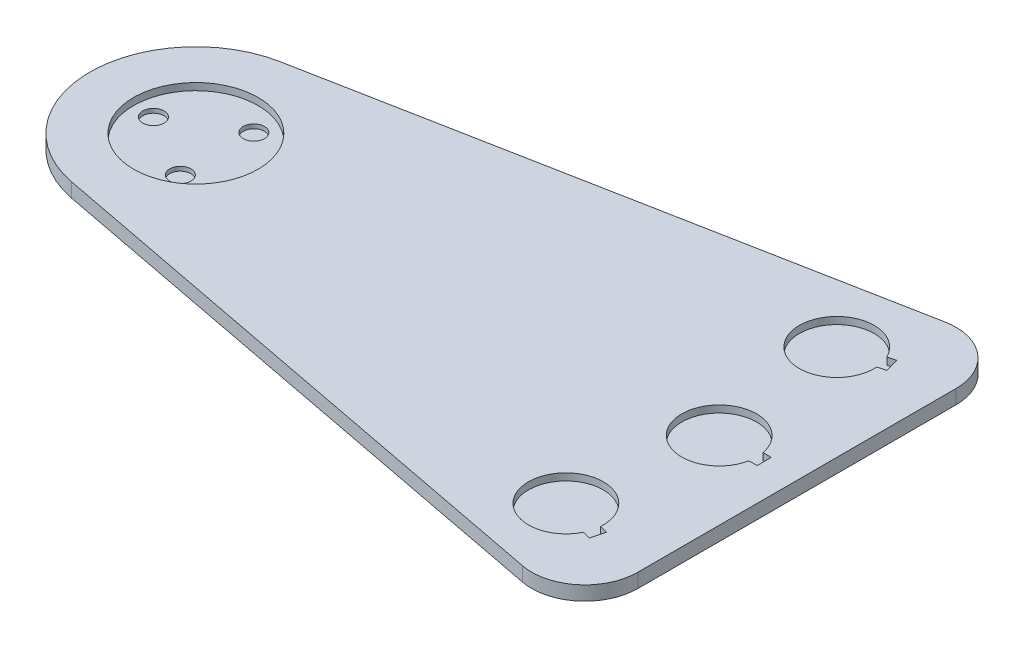
ISO-10303-21;
HEADER;
FILE_DESCRIPTION(('STEP AP214'),'2;1');
FILE_NAME('part.step','',(''),(''),'','','');
FILE_SCHEMA(('AUTOMOTIVE_DESIGN { 1 0 10303 214 1 1 1 1 }'));
ENDSEC;
DATA;
#1=APPLICATION_CONTEXT('core data for automotive mechanical design processes');
#2=APPLICATION_PROTOCOL_DEFINITION('international standard','automotive_design',2000,#1);
#3=PRODUCT_CONTEXT('',#1,'mechanical');
#4=PRODUCT('Part','Part','',(#3));
#5=PRODUCT_RELATED_PRODUCT_CATEGORY('part','',(#4));
#6=PRODUCT_DEFINITION_FORMATION('','',#4);
#7=PRODUCT_DEFINITION_CONTEXT('part definition',#1,'design');
#8=PRODUCT_DEFINITION('design','',#6,#7);
#9=PRODUCT_DEFINITION_SHAPE('','',#8);
#10=(LENGTH_UNIT() NAMED_UNIT(*) SI_UNIT(.MILLI.,.METRE.));
#11=(NAMED_UNIT(*) PLANE_ANGLE_UNIT() SI_UNIT($,.RADIAN.));
#12=(NAMED_UNIT(*) SI_UNIT($,.STERADIAN.) SOLID_ANGLE_UNIT());
#13=UNCERTAINTY_MEASURE_WITH_UNIT(LENGTH_MEASURE(1.E-05),#10,'distance_accuracy_value','');
#14=(GEOMETRIC_REPRESENTATION_CONTEXT(3) GLOBAL_UNCERTAINTY_ASSIGNED_CONTEXT((#13)) GLOBAL_UNIT_ASSIGNED_CONTEXT((#10,
#11,#12)) REPRESENTATION_CONTEXT('',''));
#15=CARTESIAN_POINT('',(0.,0.,0.));
#16=DIRECTION('',(0.,0.,1.));
#17=DIRECTION('',(1.,0.,0.));
#18=AXIS2_PLACEMENT_3D('',#15,#16,#17);
#19=CARTESIAN_POINT('',(0.,10.,0.));
#20=DIRECTION('',(0.,1.,0.));
#21=DIRECTION('',(0.,0.,1.));
#22=AXIS2_PLACEMENT_3D('',#19,#20,#21);
#23=PLANE('',#22);
#24=CARTESIAN_POINT('',(-175.,10.,0.));
#25=DIRECTION('',(0.,1.,0.));
#26=DIRECTION('',(0.,0.,1.));
#27=AXIS2_PLACEMENT_3D('',#24,#25,#26);
#28=CIRCLE('',#27,44.);
#29=CARTESIAN_POINT('',(-175.,10.,43.9999999999999));
#30=VERTEX_POINT('',#29);
#31=EDGE_CURVE('E619',#30,#30,#28,.T.);
#32=ORIENTED_EDGE('',*,*,#31,.F.);
#33=EDGE_LOOP('',(#32));
#34=FACE_BOUND('',#33,.T.);
#35=CARTESIAN_POINT('',(182.392555726955,10.,-95.7630466879329));
#36=DIRECTION('',(0.,1.,0.));
#37=DIRECTION('',(0.258819045102521,0.,0.965925826289068));
#38=AXIS2_PLACEMENT_3D('',#35,#36,#37);
#39=CIRCLE('',#38,26.46);
#40=CARTESIAN_POINT('',(206.196395839809,10.,-107.317647324982));
#41=VERTEX_POINT('',#40);
#42=CARTESIAN_POINT('',(208.784586290834,10.,-97.6583890620914));
#43=VERTEX_POINT('',#42);
#44=EDGE_CURVE('E57',#41,#43,#39,.T.);
#45=ORIENTED_EDGE('',*,*,#44,.F.);
#46=DIRECTION('',(0.965925826289068,0.,-0.258819045102521));
#47=VECTOR('',#46,1.);
#48=CARTESIAN_POINT('',(-7.2570756249257,10.,-50.1229620243866));
#49=LINE('',#48,#47);
#50=CARTESIAN_POINT('',(211.863198068749,10.,-108.836062405894));
#51=VERTEX_POINT('',#50);
#52=EDGE_CURVE('E202',#41,#51,#49,.T.);
#53=ORIENTED_EDGE('',*,*,#52,.T.);
#54=DIRECTION('',(0.258819045102521,0.,0.965925826289068));
#55=VECTOR('',#54,1.);
#56=CARTESIAN_POINT('',(213.157293294262,10.,-104.006433274448));
#57=LINE('',#56,#55);
#58=CARTESIAN_POINT('',(214.451388519775,10.,-99.1768041430029));
#59=VERTEX_POINT('',#58);
#60=EDGE_CURVE('E214',#51,#59,#57,.T.);
#61=ORIENTED_EDGE('',*,*,#60,.T.);
#62=DIRECTION('',(0.965925826289068,0.,-0.258819045102521));
#63=VECTOR('',#62,1.);
#64=CARTESIAN_POINT('',(-4.66888517390049,10.,-40.4637037614959));
#65=LINE('',#64,#63);
#66=EDGE_CURVE('E211',#43,#59,#65,.T.);
#67=ORIENTED_EDGE('',*,*,#66,.F.);
#68=EDGE_LOOP('',(#45,#53,#61,#67));
#69=FACE_BOUND('',#68,.T.);
#70=CARTESIAN_POINT('',(195.,10.,0.));
#71=DIRECTION('',(0.,1.,0.));
#72=DIRECTION('',(0.,0.,1.));
#73=AXIS2_PLACEMENT_3D('',#70,#71,#72);
#74=CIRCLE('',#73,26.46);
#75=CARTESIAN_POINT('',(220.983294633283,10.,-5.));
#76=VERTEX_POINT('',#75);
#77=CARTESIAN_POINT('',(220.983294633283,10.,5.));
#78=VERTEX_POINT('',#77);
#79=EDGE_CURVE('E221',#76,#78,#74,.T.);
#80=ORIENTED_EDGE('',*,*,#79,.F.);
#81=DIRECTION('',(1.,0.,0.));
#82=VECTOR('',#81,1.);
#83=CARTESIAN_POINT('',(0.,10.,-5.));
#84=LINE('',#83,#82);
#85=CARTESIAN_POINT('',(226.85,10.,-5.));
#86=VERTEX_POINT('',#85);
#87=EDGE_CURVE('E231',#76,#86,#84,.T.);
#88=ORIENTED_EDGE('',*,*,#87,.T.);
#89=DIRECTION('',(0.,0.,1.));
#90=VECTOR('',#89,1.);
#91=CARTESIAN_POINT('',(226.85,10.,0.));
#92=LINE('',#91,#90);
#93=CARTESIAN_POINT('',(226.85,10.,5.));
#94=VERTEX_POINT('',#93);
#95=EDGE_CURVE('E243',#86,#94,#92,.T.);
#96=ORIENTED_EDGE('',*,*,#95,.T.);
#97=DIRECTION('',(1.,0.,0.));
#98=VECTOR('',#97,1.);
#99=CARTESIAN_POINT('',(0.,10.,5.));
#100=LINE('',#99,#98);
#101=EDGE_CURVE('E240',#78,#94,#100,.T.);
#102=ORIENTED_EDGE('',*,*,#101,.F.);
#103=EDGE_LOOP('',(#80,#88,#96,#102));
#104=FACE_BOUND('',#103,.T.);
#105=DIRECTION('',(0.,0.,-1.));
#106=VECTOR('',#105,1.);
#107=CARTESIAN_POINT('',(250.,10.,-150.));
#108=LINE('',#107,#106);
#109=CARTESIAN_POINT('',(250.,10.,112.5));
#110=VERTEX_POINT('',#109);
#111=CARTESIAN_POINT('',(250.,10.,-112.5));
#112=VERTEX_POINT('',#111);
#113=EDGE_CURVE('E291',#110,#112,#108,.T.);
#114=ORIENTED_EDGE('',*,*,#113,.T.);
#115=CARTESIAN_POINT('',(212.5,10.,-112.5));
#116=DIRECTION('',(0.,1.,0.));
#117=DIRECTION('',(0.,0.,1.));
#118=AXIS2_PLACEMENT_3D('',#115,#116,#117);
#119=CIRCLE('',#118,37.5);
#120=CARTESIAN_POINT('',(205.4367974002,10.,-149.328808954868));
#121=VERTEX_POINT('',#120);
#122=EDGE_CURVE('E271',#112,#121,#119,.T.);
#123=ORIENTED_EDGE('',*,*,#122,.T.);
#124=DIRECTION('',(-0.982101572129816,0.,0.188352069328011));
#125=VECTOR('',#124,1.);
#126=CARTESIAN_POINT('',(-189.126405199601,10.,-73.6576179097362));
#127=LINE('',#126,#125);
#128=CARTESIAN_POINT('',(-189.126405199601,10.,-73.6576179097362));
#129=VERTEX_POINT('',#128);
#130=EDGE_CURVE('E261',#121,#129,#127,.T.);
#131=ORIENTED_EDGE('',*,*,#130,.T.);
#132=CARTESIAN_POINT('',(-175.,10.,0.));
#133=DIRECTION('',(0.,1.,0.));
#134=DIRECTION('',(0.,0.,1.));
#135=AXIS2_PLACEMENT_3D('',#132,#133,#134);
#136=CIRCLE('',#135,75.);
#137=CARTESIAN_POINT('',(-189.126405199601,10.,73.6576179097362));
#138=VERTEX_POINT('',#137);
#139=EDGE_CURVE('E250',#129,#138,#136,.T.);
#140=ORIENTED_EDGE('',*,*,#139,.T.);
#141=DIRECTION('',(0.982101572129816,0.,0.188352069328011));
#142=VECTOR('',#141,1.);
#143=CARTESIAN_POINT('',(-189.126405199601,10.,73.6576179097362));
#144=LINE('',#143,#142);
#145=CARTESIAN_POINT('',(205.4367974002,10.,149.328808954868));
#146=VERTEX_POINT('',#145);
#147=EDGE_CURVE('E266',#138,#146,#144,.T.);
#148=ORIENTED_EDGE('',*,*,#147,.T.);
#149=CARTESIAN_POINT('',(212.5,10.,112.5));
#150=DIRECTION('',(0.,1.,0.));
#151=DIRECTION('',(0.,0.,1.));
#152=AXIS2_PLACEMENT_3D('',#149,#150,#151);
#153=CIRCLE('',#152,37.5);
#154=EDGE_CURVE('E269',#146,#110,#153,.T.);
#155=ORIENTED_EDGE('',*,*,#154,.T.);
#156=EDGE_LOOP('',(#114,#123,#131,#140,#148,#155));
#157=FACE_BOUND('',#156,.T.);
#158=DIRECTION('',(0.965925826289068,0.,0.258819045102521));
#159=VECTOR('',#158,1.);
#160=CARTESIAN_POINT('',(-7.2570756249257,10.,50.1229620243866));
#161=LINE('',#160,#159);
#162=CARTESIAN_POINT('',(206.196395839809,10.,107.317647324982));
#163=VERTEX_POINT('',#162);
#164=CARTESIAN_POINT('',(211.863198068749,10.,108.836062405894));
#165=VERTEX_POINT('',#164);
#166=EDGE_CURVE('E185',#163,#165,#161,.T.);
#167=ORIENTED_EDGE('',*,*,#166,.F.);
#168=CARTESIAN_POINT('',(182.392555726955,10.,95.7630466879329));
#169=DIRECTION('',(0.,-1.,0.));
#170=DIRECTION('',(0.258819045102521,0.,-0.965925826289068));
#171=AXIS2_PLACEMENT_3D('',#168,#169,#170);
#172=CIRCLE('',#171,26.46);
#173=CARTESIAN_POINT('',(208.784586290834,10.,97.6583890620914));
#174=VERTEX_POINT('',#173);
#175=EDGE_CURVE('E49',#163,#174,#172,.T.);
#176=ORIENTED_EDGE('',*,*,#175,.T.);
#177=DIRECTION('',(0.965925826289068,0.,0.258819045102521));
#178=VECTOR('',#177,1.);
#179=CARTESIAN_POINT('',(-4.66888517390049,10.,40.4637037614959));
#180=LINE('',#179,#178);
#181=CARTESIAN_POINT('',(214.451388519775,10.,99.1768041430029));
#182=VERTEX_POINT('',#181);
#183=EDGE_CURVE('E174',#174,#182,#180,.T.);
#184=ORIENTED_EDGE('',*,*,#183,.T.);
#185=DIRECTION('',(0.258819045102521,0.,-0.965925826289068));
#186=VECTOR('',#185,1.);
#187=CARTESIAN_POINT('',(213.157293294262,10.,104.006433274448));
#188=LINE('',#187,#186);
#189=EDGE_CURVE('E188',#165,#182,#188,.T.);
#190=ORIENTED_EDGE('',*,*,#189,.F.);
#191=EDGE_LOOP('',(#167,#176,#184,#190));
#192=FACE_BOUND('',#191,.T.);
#193=ADVANCED_FACE('F33',(#34,#69,#104,#157,#192),#23,.T.);
#194=CARTESIAN_POINT('',(250.,10.,-150.));
#195=DIRECTION('',(-1.,0.,0.));
#196=DIRECTION('',(0.,0.,1.));
#197=AXIS2_PLACEMENT_3D('',#194,#195,#196);
#198=PLANE('',#197);
#199=DIRECTION('',(0.,0.,-1.));
#200=VECTOR('',#199,1.);
#201=CARTESIAN_POINT('',(250.,0.,-150.));
#202=LINE('',#201,#200);
#203=CARTESIAN_POINT('',(250.,0.,112.5));
#204=VERTEX_POINT('',#203);
#205=CARTESIAN_POINT('',(250.,0.,-112.5));
#206=VERTEX_POINT('',#205);
#207=EDGE_CURVE('E277',#204,#206,#202,.T.);
#208=ORIENTED_EDGE('',*,*,#207,.T.);
#209=DIRECTION('',(0.,1.,0.));
#210=VECTOR('',#209,1.);
#211=CARTESIAN_POINT('',(250.,0.,-112.5));
#212=LINE('',#211,#210);
#213=EDGE_CURVE('E281',#206,#112,#212,.T.);
#214=ORIENTED_EDGE('',*,*,#213,.T.);
#215=ORIENTED_EDGE('',*,*,#113,.F.);
#216=DIRECTION('',(0.,1.,0.));
#217=VECTOR('',#216,1.);
#218=CARTESIAN_POINT('',(250.,0.,112.5));
#219=LINE('',#218,#217);
#220=EDGE_CURVE('E284',#204,#110,#219,.T.);
#221=ORIENTED_EDGE('',*,*,#220,.F.);
#222=EDGE_LOOP('',(#208,#214,#215,#221));
#223=FACE_BOUND('',#222,.T.);
#224=ADVANCED_FACE('F35',(#223),#198,.F.);
#225=CARTESIAN_POINT('',(0.,0.,0.));
#226=DIRECTION('',(0.,1.,0.));
#227=DIRECTION('',(0.,0.,1.));
#228=AXIS2_PLACEMENT_3D('',#225,#226,#227);
#229=PLANE('',#228);
#230=CARTESIAN_POINT('',(212.5,0.,-112.5));
#231=DIRECTION('',(0.,1.,0.));
#232=DIRECTION('',(0.,0.,1.));
#233=AXIS2_PLACEMENT_3D('',#230,#231,#232);
#234=CIRCLE('',#233,37.5);
#235=CARTESIAN_POINT('',(205.4367974002,0.,-149.328808954868));
#236=VERTEX_POINT('',#235);
#237=EDGE_CURVE('E12',#206,#236,#234,.T.);
#238=ORIENTED_EDGE('',*,*,#237,.F.);
#239=ORIENTED_EDGE('',*,*,#207,.F.);
#240=CARTESIAN_POINT('',(212.5,0.,112.5));
#241=DIRECTION('',(0.,1.,0.));
#242=DIRECTION('',(0.,0.,1.));
#243=AXIS2_PLACEMENT_3D('',#240,#241,#242);
#244=CIRCLE('',#243,37.5);
#245=CARTESIAN_POINT('',(205.4367974002,0.,149.328808954868));
#246=VERTEX_POINT('',#245);
#247=EDGE_CURVE('E294',#246,#204,#244,.T.);
#248=ORIENTED_EDGE('',*,*,#247,.F.);
#249=DIRECTION('',(0.982101572129816,0.,0.188352069328011));
#250=VECTOR('',#249,1.);
#251=CARTESIAN_POINT('',(-189.126405199601,0.,73.6576179097362));
#252=LINE('',#251,#250);
#253=CARTESIAN_POINT('',(-189.126405199601,0.,73.6576179097362));
#254=VERTEX_POINT('',#253);
#255=EDGE_CURVE('E257',#254,#246,#252,.T.);
#256=ORIENTED_EDGE('',*,*,#255,.F.);
#257=CARTESIAN_POINT('',(-175.,0.,0.));
#258=DIRECTION('',(0.,1.,0.));
#259=DIRECTION('',(0.,0.,1.));
#260=AXIS2_PLACEMENT_3D('',#257,#258,#259);
#261=CIRCLE('',#260,75.);
#262=CARTESIAN_POINT('',(-189.126405199601,0.,-73.6576179097362));
#263=VERTEX_POINT('',#262);
#264=EDGE_CURVE('E42',#263,#254,#261,.T.);
#265=ORIENTED_EDGE('',*,*,#264,.F.);
#266=DIRECTION('',(-0.982101572129816,0.,0.188352069328011));
#267=VECTOR('',#266,1.);
#268=CARTESIAN_POINT('',(-189.126405199601,0.,-73.6576179097362));
#269=LINE('',#268,#267);
#270=EDGE_CURVE('E260',#236,#263,#269,.T.);
#271=ORIENTED_EDGE('',*,*,#270,.F.);
#272=EDGE_LOOP('',(#238,#239,#248,#256,#265,#271));
#273=FACE_BOUND('',#272,.T.);
#274=ADVANCED_FACE('F307',(#273),#229,.F.);
#275=CARTESIAN_POINT('',(-175.,0.,0.));
#276=DIRECTION('',(0.,1.,0.));
#277=DIRECTION('',(0.,0.,1.));
#278=AXIS2_PLACEMENT_3D('',#275,#276,#277);
#279=CYLINDRICAL_SURFACE('',#278,75.);
#280=DIRECTION('',(0.,1.,0.));
#281=VECTOR('',#280,1.);
#282=CARTESIAN_POINT('',(-189.126405199601,0.,-73.6576179097362));
#283=LINE('',#282,#281);
#284=EDGE_CURVE('E275',#263,#129,#283,.T.);
#285=ORIENTED_EDGE('',*,*,#284,.F.);
#286=ORIENTED_EDGE('',*,*,#264,.T.);
#287=DIRECTION('',(0.,1.,0.));
#288=VECTOR('',#287,1.);
#289=CARTESIAN_POINT('',(-189.126405199601,0.,73.6576179097362));
#290=LINE('',#289,#288);
#291=EDGE_CURVE('E264',#254,#138,#290,.T.);
#292=ORIENTED_EDGE('',*,*,#291,.T.);
#293=ORIENTED_EDGE('',*,*,#139,.F.);
#294=EDGE_LOOP('',(#285,#286,#292,#293));
#295=FACE_BOUND('',#294,.T.);
#296=ADVANCED_FACE('F302',(#295),#279,.T.);
#297=CARTESIAN_POINT('',(212.5,0.,-112.5));
#298=DIRECTION('',(0.,1.,0.));
#299=DIRECTION('',(0.,0.,1.));
#300=AXIS2_PLACEMENT_3D('',#297,#298,#299);
#301=CYLINDRICAL_SURFACE('',#300,37.5);
#302=ORIENTED_EDGE('',*,*,#213,.F.);
#303=ORIENTED_EDGE('',*,*,#237,.T.);
#304=DIRECTION('',(0.,1.,0.));
#305=VECTOR('',#304,1.);
#306=CARTESIAN_POINT('',(205.4367974002,0.,-149.328808954868));
#307=LINE('',#306,#305);
#308=EDGE_CURVE('E278',#236,#121,#307,.T.);
#309=ORIENTED_EDGE('',*,*,#308,.T.);
#310=ORIENTED_EDGE('',*,*,#122,.F.);
#311=EDGE_LOOP('',(#302,#303,#309,#310));
#312=FACE_BOUND('',#311,.T.);
#313=ADVANCED_FACE('F321',(#312),#301,.T.);
#314=CARTESIAN_POINT('',(212.5,0.,112.5));
#315=DIRECTION('',(0.,1.,0.));
#316=DIRECTION('',(0.,0.,1.));
#317=AXIS2_PLACEMENT_3D('',#314,#315,#316);
#318=CYLINDRICAL_SURFACE('',#317,37.5);
#319=DIRECTION('',(0.,1.,0.));
#320=VECTOR('',#319,1.);
#321=CARTESIAN_POINT('',(205.4367974002,0.,149.328808954868));
#322=LINE('',#321,#320);
#323=EDGE_CURVE('E287',#246,#146,#322,.T.);
#324=ORIENTED_EDGE('',*,*,#323,.F.);
#325=ORIENTED_EDGE('',*,*,#247,.T.);
#326=ORIENTED_EDGE('',*,*,#220,.T.);
#327=ORIENTED_EDGE('',*,*,#154,.F.);
#328=EDGE_LOOP('',(#324,#325,#326,#327));
#329=FACE_BOUND('',#328,.T.);
#330=ADVANCED_FACE('F326',(#329),#318,.T.);
#331=CARTESIAN_POINT('',(-189.126405199601,0.,-73.6576179097362));
#332=DIRECTION('',(-0.188352069328011,0.,-0.982101572129816));
#333=DIRECTION('',(-0.982101572129816,0.,0.188352069328011));
#334=AXIS2_PLACEMENT_3D('',#331,#332,#333);
#335=PLANE('',#334);
#336=ORIENTED_EDGE('',*,*,#130,.F.);
#337=ORIENTED_EDGE('',*,*,#308,.F.);
#338=ORIENTED_EDGE('',*,*,#270,.T.);
#339=ORIENTED_EDGE('',*,*,#284,.T.);
#340=EDGE_LOOP('',(#336,#337,#338,#339));
#341=FACE_BOUND('',#340,.T.);
#342=ADVANCED_FACE('F318',(#341),#335,.T.);
#343=CARTESIAN_POINT('',(-189.126405199601,0.,73.6576179097362));
#344=DIRECTION('',(-0.188352069328011,0.,0.982101572129816));
#345=DIRECTION('',(0.982101572129816,0.,0.188352069328011));
#346=AXIS2_PLACEMENT_3D('',#343,#344,#345);
#347=PLANE('',#346);
#348=ORIENTED_EDGE('',*,*,#147,.F.);
#349=ORIENTED_EDGE('',*,*,#291,.F.);
#350=ORIENTED_EDGE('',*,*,#255,.T.);
#351=ORIENTED_EDGE('',*,*,#323,.T.);
#352=EDGE_LOOP('',(#348,#349,#350,#351));
#353=FACE_BOUND('',#352,.T.);
#354=ADVANCED_FACE('F311',(#353),#347,.T.);
#355=CARTESIAN_POINT('',(195.,5.,0.));
#356=DIRECTION('',(0.,1.,0.));
#357=DIRECTION('',(0.,0.,1.));
#358=AXIS2_PLACEMENT_3D('',#355,#356,#357);
#359=CYLINDRICAL_SURFACE('',#358,26.46);
#360=ORIENTED_EDGE('',*,*,#79,.T.);
#361=DIRECTION('',(0.,1.,0.));
#362=VECTOR('',#361,1.);
#363=CARTESIAN_POINT('',(220.983294633283,5.,5.));
#364=LINE('',#363,#362);
#365=CARTESIAN_POINT('',(220.983294633283,5.,5.));
#366=VERTEX_POINT('',#365);
#367=EDGE_CURVE('E238',#366,#78,#364,.T.);
#368=ORIENTED_EDGE('',*,*,#367,.F.);
#369=CARTESIAN_POINT('',(195.,5.,0.));
#370=DIRECTION('',(0.,1.,0.));
#371=DIRECTION('',(0.,0.,1.));
#372=AXIS2_PLACEMENT_3D('',#369,#370,#371);
#373=CIRCLE('',#372,26.46);
#374=CARTESIAN_POINT('',(220.983294633283,5.,-5.));
#375=VERTEX_POINT('',#374);
#376=EDGE_CURVE('E227',#375,#366,#373,.T.);
#377=ORIENTED_EDGE('',*,*,#376,.F.);
#378=DIRECTION('',(0.,1.,0.));
#379=VECTOR('',#378,1.);
#380=CARTESIAN_POINT('',(220.983294633283,5.,-5.));
#381=LINE('',#380,#379);
#382=EDGE_CURVE('E248',#375,#76,#381,.T.);
#383=ORIENTED_EDGE('',*,*,#382,.T.);
#384=EDGE_LOOP('',(#360,#368,#377,#383));
#385=FACE_BOUND('',#384,.T.);
#386=ADVANCED_FACE('F374',(#385),#359,.F.);
#387=CARTESIAN_POINT('',(0.,5.,-5.));
#388=DIRECTION('',(0.,0.,1.));
#389=DIRECTION('',(1.,0.,0.));
#390=AXIS2_PLACEMENT_3D('',#387,#388,#389);
#391=PLANE('',#390);
#392=ORIENTED_EDGE('',*,*,#87,.F.);
#393=ORIENTED_EDGE('',*,*,#382,.F.);
#394=DIRECTION('',(1.,0.,0.));
#395=VECTOR('',#394,1.);
#396=CARTESIAN_POINT('',(0.,5.,-5.));
#397=LINE('',#396,#395);
#398=CARTESIAN_POINT('',(226.85,5.,-5.));
#399=VERTEX_POINT('',#398);
#400=EDGE_CURVE('E236',#375,#399,#397,.T.);
#401=ORIENTED_EDGE('',*,*,#400,.T.);
#402=DIRECTION('',(0.,1.,0.));
#403=VECTOR('',#402,1.);
#404=CARTESIAN_POINT('',(226.85,5.,-5.));
#405=LINE('',#404,#403);
#406=EDGE_CURVE('E251',#399,#86,#405,.T.);
#407=ORIENTED_EDGE('',*,*,#406,.T.);
#408=EDGE_LOOP('',(#392,#393,#401,#407));
#409=FACE_BOUND('',#408,.T.);
#410=ADVANCED_FACE('F382',(#409),#391,.T.);
#411=CARTESIAN_POINT('',(226.85,5.,0.));
#412=DIRECTION('',(-1.,0.,0.));
#413=DIRECTION('',(0.,0.,1.));
#414=AXIS2_PLACEMENT_3D('',#411,#412,#413);
#415=PLANE('',#414);
#416=ORIENTED_EDGE('',*,*,#95,.F.);
#417=ORIENTED_EDGE('',*,*,#406,.F.);
#418=DIRECTION('',(0.,0.,1.));
#419=VECTOR('',#418,1.);
#420=CARTESIAN_POINT('',(226.85,5.,0.));
#421=LINE('',#420,#419);
#422=CARTESIAN_POINT('',(226.85,5.,5.));
#423=VERTEX_POINT('',#422);
#424=EDGE_CURVE('E234',#399,#423,#421,.T.);
#425=ORIENTED_EDGE('',*,*,#424,.T.);
#426=DIRECTION('',(0.,1.,0.));
#427=VECTOR('',#426,1.);
#428=CARTESIAN_POINT('',(226.85,5.,5.));
#429=LINE('',#428,#427);
#430=EDGE_CURVE('E253',#423,#94,#429,.T.);
#431=ORIENTED_EDGE('',*,*,#430,.T.);
#432=EDGE_LOOP('',(#416,#417,#425,#431));
#433=FACE_BOUND('',#432,.T.);
#434=ADVANCED_FACE('F392',(#433),#415,.T.);
#435=CARTESIAN_POINT('',(0.,5.,5.));
#436=DIRECTION('',(0.,0.,1.));
#437=DIRECTION('',(1.,0.,0.));
#438=AXIS2_PLACEMENT_3D('',#435,#436,#437);
#439=PLANE('',#438);
#440=ORIENTED_EDGE('',*,*,#101,.T.);
#441=ORIENTED_EDGE('',*,*,#430,.F.);
#442=DIRECTION('',(1.,0.,0.));
#443=VECTOR('',#442,1.);
#444=CARTESIAN_POINT('',(0.,5.,5.));
#445=LINE('',#444,#443);
#446=EDGE_CURVE('E230',#366,#423,#445,.T.);
#447=ORIENTED_EDGE('',*,*,#446,.F.);
#448=ORIENTED_EDGE('',*,*,#367,.T.);
#449=EDGE_LOOP('',(#440,#441,#447,#448));
#450=FACE_BOUND('',#449,.T.);
#451=ADVANCED_FACE('F402',(#450),#439,.F.);
#452=CARTESIAN_POINT('',(0.,5.,0.));
#453=DIRECTION('',(0.,1.,0.));
#454=DIRECTION('',(0.,0.,1.));
#455=AXIS2_PLACEMENT_3D('',#452,#453,#454);
#456=PLANE('',#455);
#457=ORIENTED_EDGE('',*,*,#376,.T.);
#458=ORIENTED_EDGE('',*,*,#446,.T.);
#459=ORIENTED_EDGE('',*,*,#424,.F.);
#460=ORIENTED_EDGE('',*,*,#400,.F.);
#461=EDGE_LOOP('',(#457,#458,#459,#460));
#462=FACE_BOUND('',#461,.T.);
#463=ADVANCED_FACE('F412',(#462),#456,.T.);
#464=CARTESIAN_POINT('',(182.392555726955,5.,-95.7630466879329));
#465=DIRECTION('',(0.,1.,0.));
#466=DIRECTION('',(0.,0.,1.));
#467=AXIS2_PLACEMENT_3D('',#464,#465,#466);
#468=CYLINDRICAL_SURFACE('',#467,26.46);
#469=ORIENTED_EDGE('',*,*,#44,.T.);
#470=DIRECTION('',(0.,1.,0.));
#471=VECTOR('',#470,1.);
#472=CARTESIAN_POINT('',(208.784586290834,5.,-97.6583890620914));
#473=LINE('',#472,#471);
#474=CARTESIAN_POINT('',(208.784586290834,5.,-97.6583890620914));
#475=VERTEX_POINT('',#474);
#476=EDGE_CURVE('E209',#475,#43,#473,.T.);
#477=ORIENTED_EDGE('',*,*,#476,.F.);
#478=CARTESIAN_POINT('',(182.392555726955,5.,-95.7630466879329));
#479=DIRECTION('',(0.,1.,0.));
#480=DIRECTION('',(0.258819045102521,0.,0.965925826289068));
#481=AXIS2_PLACEMENT_3D('',#478,#479,#480);
#482=CIRCLE('',#481,26.46);
#483=CARTESIAN_POINT('',(206.196395839809,5.,-107.317647324982));
#484=VERTEX_POINT('',#483);
#485=EDGE_CURVE('E198',#484,#475,#482,.T.);
#486=ORIENTED_EDGE('',*,*,#485,.F.);
#487=DIRECTION('',(0.,1.,0.));
#488=VECTOR('',#487,1.);
#489=CARTESIAN_POINT('',(206.196395839809,5.,-107.317647324982));
#490=LINE('',#489,#488);
#491=EDGE_CURVE('E219',#484,#41,#490,.T.);
#492=ORIENTED_EDGE('',*,*,#491,.T.);
#493=EDGE_LOOP('',(#469,#477,#486,#492));
#494=FACE_BOUND('',#493,.T.);
#495=ADVANCED_FACE('F423',(#494),#468,.F.);
#496=CARTESIAN_POINT('',(-7.2570756249257,5.,-50.1229620243866));
#497=DIRECTION('',(0.258819045102521,0.,0.965925826289068));
#498=DIRECTION('',(0.965925826289068,0.,-0.258819045102521));
#499=AXIS2_PLACEMENT_3D('',#496,#497,#498);
#500=PLANE('',#499);
#501=ORIENTED_EDGE('',*,*,#52,.F.);
#502=ORIENTED_EDGE('',*,*,#491,.F.);
#503=DIRECTION('',(0.965925826289068,0.,-0.258819045102521));
#504=VECTOR('',#503,1.);
#505=CARTESIAN_POINT('',(-7.2570756249257,5.,-50.1229620243866));
#506=LINE('',#505,#504);
#507=CARTESIAN_POINT('',(211.863198068749,5.,-108.836062405894));
#508=VERTEX_POINT('',#507);
#509=EDGE_CURVE('E207',#484,#508,#506,.T.);
#510=ORIENTED_EDGE('',*,*,#509,.T.);
#511=DIRECTION('',(0.,1.,0.));
#512=VECTOR('',#511,1.);
#513=CARTESIAN_POINT('',(211.863198068749,5.,-108.836062405894));
#514=LINE('',#513,#512);
#515=EDGE_CURVE('E222',#508,#51,#514,.T.);
#516=ORIENTED_EDGE('',*,*,#515,.T.);
#517=EDGE_LOOP('',(#501,#502,#510,#516));
#518=FACE_BOUND('',#517,.T.);
#519=ADVANCED_FACE('F433',(#518),#500,.T.);
#520=CARTESIAN_POINT('',(213.157293294262,5.,-104.006433274448));
#521=DIRECTION('',(-0.965925826289068,0.,0.258819045102521));
#522=DIRECTION('',(0.258819045102521,0.,0.965925826289068));
#523=AXIS2_PLACEMENT_3D('',#520,#521,#522);
#524=PLANE('',#523);
#525=ORIENTED_EDGE('',*,*,#60,.F.);
#526=ORIENTED_EDGE('',*,*,#515,.F.);
#527=DIRECTION('',(0.258819045102521,0.,0.965925826289068));
#528=VECTOR('',#527,1.);
#529=CARTESIAN_POINT('',(213.157293294262,5.,-104.006433274448));
#530=LINE('',#529,#528);
#531=CARTESIAN_POINT('',(214.451388519775,5.,-99.1768041430029));
#532=VERTEX_POINT('',#531);
#533=EDGE_CURVE('E205',#508,#532,#530,.T.);
#534=ORIENTED_EDGE('',*,*,#533,.T.);
#535=DIRECTION('',(0.,1.,0.));
#536=VECTOR('',#535,1.);
#537=CARTESIAN_POINT('',(214.451388519775,5.,-99.1768041430029));
#538=LINE('',#537,#536);
#539=EDGE_CURVE('E224',#532,#59,#538,.T.);
#540=ORIENTED_EDGE('',*,*,#539,.T.);
#541=EDGE_LOOP('',(#525,#526,#534,#540));
#542=FACE_BOUND('',#541,.T.);
#543=ADVANCED_FACE('F442',(#542),#524,.T.);
#544=CARTESIAN_POINT('',(-4.66888517390049,5.,-40.4637037614959));
#545=DIRECTION('',(0.258819045102521,0.,0.965925826289068));
#546=DIRECTION('',(0.965925826289068,0.,-0.258819045102521));
#547=AXIS2_PLACEMENT_3D('',#544,#545,#546);
#548=PLANE('',#547);
#549=ORIENTED_EDGE('',*,*,#66,.T.);
#550=ORIENTED_EDGE('',*,*,#539,.F.);
#551=DIRECTION('',(0.965925826289068,0.,-0.258819045102521));
#552=VECTOR('',#551,1.);
#553=CARTESIAN_POINT('',(-4.66888517390049,5.,-40.4637037614959));
#554=LINE('',#553,#552);
#555=EDGE_CURVE('E201',#475,#532,#554,.T.);
#556=ORIENTED_EDGE('',*,*,#555,.F.);
#557=ORIENTED_EDGE('',*,*,#476,.T.);
#558=EDGE_LOOP('',(#549,#550,#556,#557));
#559=FACE_BOUND('',#558,.T.);
#560=ADVANCED_FACE('F452',(#559),#548,.F.);
#561=CARTESIAN_POINT('',(-5.96298039941309,5.,-45.2933328929412));
#562=DIRECTION('',(0.,1.,0.));
#563=DIRECTION('',(0.258819045102521,0.,0.965925826289068));
#564=AXIS2_PLACEMENT_3D('',#561,#562,#563);
#565=PLANE('',#564);
#566=ORIENTED_EDGE('',*,*,#485,.T.);
#567=ORIENTED_EDGE('',*,*,#555,.T.);
#568=ORIENTED_EDGE('',*,*,#533,.F.);
#569=ORIENTED_EDGE('',*,*,#509,.F.);
#570=EDGE_LOOP('',(#566,#567,#568,#569));
#571=FACE_BOUND('',#570,.T.);
#572=ADVANCED_FACE('F462',(#571),#565,.T.);
#573=CARTESIAN_POINT('',(182.392555726955,5.,95.7630466879329));
#574=DIRECTION('',(0.,1.,0.));
#575=DIRECTION('',(0.,0.,1.));
#576=AXIS2_PLACEMENT_3D('',#573,#574,#575);
#577=CYLINDRICAL_SURFACE('',#576,26.46);
#578=ORIENTED_EDGE('',*,*,#175,.F.);
#579=DIRECTION('',(0.,1.,0.));
#580=VECTOR('',#579,1.);
#581=CARTESIAN_POINT('',(206.196395839809,5.,107.317647324982));
#582=LINE('',#581,#580);
#583=CARTESIAN_POINT('',(206.196395839809,5.,107.317647324982));
#584=VERTEX_POINT('',#583);
#585=EDGE_CURVE('E157',#584,#163,#582,.T.);
#586=ORIENTED_EDGE('',*,*,#585,.F.);
#587=CARTESIAN_POINT('',(182.392555726955,5.,95.7630466879329));
#588=DIRECTION('',(0.,-1.,0.));
#589=DIRECTION('',(0.258819045102521,0.,-0.965925826289068));
#590=AXIS2_PLACEMENT_3D('',#587,#588,#589);
#591=CIRCLE('',#590,26.46);
#592=CARTESIAN_POINT('',(208.784586290834,5.,97.6583890620914));
#593=VERTEX_POINT('',#592);
#594=EDGE_CURVE('E160',#584,#593,#591,.T.);
#595=ORIENTED_EDGE('',*,*,#594,.T.);
#596=DIRECTION('',(0.,1.,0.));
#597=VECTOR('',#596,1.);
#598=CARTESIAN_POINT('',(208.784586290834,5.,97.6583890620914));
#599=LINE('',#598,#597);
#600=EDGE_CURVE('E193',#593,#174,#599,.T.);
#601=ORIENTED_EDGE('',*,*,#600,.T.);
#602=EDGE_LOOP('',(#578,#586,#595,#601));
#603=FACE_BOUND('',#602,.T.);
#604=ADVANCED_FACE('F159',(#603),#577,.F.);
#605=CARTESIAN_POINT('',(-4.66888517390049,5.,40.4637037614959));
#606=DIRECTION('',(-0.258819045102521,0.,0.965925826289068));
#607=DIRECTION('',(0.965925826289068,0.,0.258819045102521));
#608=AXIS2_PLACEMENT_3D('',#605,#606,#607);
#609=PLANE('',#608);
#610=ORIENTED_EDGE('',*,*,#183,.F.);
#611=ORIENTED_EDGE('',*,*,#600,.F.);
#612=DIRECTION('',(0.965925826289068,0.,0.258819045102521));
#613=VECTOR('',#612,1.);
#614=CARTESIAN_POINT('',(-4.66888517390049,5.,40.4637037614959));
#615=LINE('',#614,#613);
#616=CARTESIAN_POINT('',(214.451388519775,5.,99.1768041430029));
#617=VERTEX_POINT('',#616);
#618=EDGE_CURVE('E167',#593,#617,#615,.T.);
#619=ORIENTED_EDGE('',*,*,#618,.T.);
#620=DIRECTION('',(0.,1.,0.));
#621=VECTOR('',#620,1.);
#622=CARTESIAN_POINT('',(214.451388519775,5.,99.1768041430029));
#623=LINE('',#622,#621);
#624=EDGE_CURVE('E195',#617,#182,#623,.T.);
#625=ORIENTED_EDGE('',*,*,#624,.T.);
#626=EDGE_LOOP('',(#610,#611,#619,#625));
#627=FACE_BOUND('',#626,.T.);
#628=ADVANCED_FACE('F483',(#627),#609,.T.);
#629=CARTESIAN_POINT('',(213.157293294262,5.,104.006433274448));
#630=DIRECTION('',(0.965925826289068,0.,0.258819045102521));
#631=DIRECTION('',(0.258819045102521,0.,-0.965925826289068));
#632=AXIS2_PLACEMENT_3D('',#629,#630,#631);
#633=PLANE('',#632);
#634=ORIENTED_EDGE('',*,*,#189,.T.);
#635=ORIENTED_EDGE('',*,*,#624,.F.);
#636=DIRECTION('',(0.258819045102521,0.,-0.965925826289068));
#637=VECTOR('',#636,1.);
#638=CARTESIAN_POINT('',(213.157293294262,5.,104.006433274448));
#639=LINE('',#638,#637);
#640=CARTESIAN_POINT('',(211.863198068749,5.,108.836062405894));
#641=VERTEX_POINT('',#640);
#642=EDGE_CURVE('E178',#641,#617,#639,.T.);
#643=ORIENTED_EDGE('',*,*,#642,.F.);
#644=DIRECTION('',(0.,1.,0.));
#645=VECTOR('',#644,1.);
#646=CARTESIAN_POINT('',(211.863198068749,5.,108.836062405894));
#647=LINE('',#646,#645);
#648=EDGE_CURVE('E166',#641,#165,#647,.T.);
#649=ORIENTED_EDGE('',*,*,#648,.T.);
#650=EDGE_LOOP('',(#634,#635,#643,#649));
#651=FACE_BOUND('',#650,.T.);
#652=ADVANCED_FACE('F492',(#651),#633,.F.);
#653=CARTESIAN_POINT('',(-7.2570756249257,5.,50.1229620243866));
#654=DIRECTION('',(-0.258819045102521,0.,0.965925826289068));
#655=DIRECTION('',(0.965925826289068,0.,0.258819045102521));
#656=AXIS2_PLACEMENT_3D('',#653,#654,#655);
#657=PLANE('',#656);
#658=ORIENTED_EDGE('',*,*,#166,.T.);
#659=ORIENTED_EDGE('',*,*,#648,.F.);
#660=DIRECTION('',(0.965925826289068,0.,0.258819045102521));
#661=VECTOR('',#660,1.);
#662=CARTESIAN_POINT('',(-7.2570756249257,5.,50.1229620243866));
#663=LINE('',#662,#661);
#664=EDGE_CURVE('E173',#584,#641,#663,.T.);
#665=ORIENTED_EDGE('',*,*,#664,.F.);
#666=ORIENTED_EDGE('',*,*,#585,.T.);
#667=EDGE_LOOP('',(#658,#659,#665,#666));
#668=FACE_BOUND('',#667,.T.);
#669=ADVANCED_FACE('F176',(#668),#657,.F.);
#670=CARTESIAN_POINT('',(-5.96298039941309,5.,45.2933328929412));
#671=DIRECTION('',(0.,1.,0.));
#672=DIRECTION('',(0.258819045102521,0.,-0.965925826289068));
#673=AXIS2_PLACEMENT_3D('',#670,#671,#672);
#674=PLANE('',#673);
#675=ORIENTED_EDGE('',*,*,#594,.F.);
#676=ORIENTED_EDGE('',*,*,#664,.T.);
#677=ORIENTED_EDGE('',*,*,#642,.T.);
#678=ORIENTED_EDGE('',*,*,#618,.F.);
#679=EDGE_LOOP('',(#675,#676,#677,#678));
#680=FACE_BOUND('',#679,.T.);
#681=ADVANCED_FACE('F171',(#680),#674,.T.);
#682=CARTESIAN_POINT('',(-175.,5.,0.));
#683=DIRECTION('',(0.,1.,0.));
#684=DIRECTION('',(0.,0.,1.));
#685=AXIS2_PLACEMENT_3D('',#682,#683,#684);
#686=PLANE('',#685);
#687=CARTESIAN_POINT('',(-175.,5.,0.));
#688=DIRECTION('',(0.,1.,0.));
#689=DIRECTION('',(0.,0.,1.));
#690=AXIS2_PLACEMENT_3D('',#687,#688,#689);
#691=CIRCLE('',#690,44.);
#692=CARTESIAN_POINT('',(-175.,5.,43.9999999999999));
#693=VERTEX_POINT('',#692);
#694=EDGE_CURVE('E614',#693,#693,#691,.T.);
#695=ORIENTED_EDGE('',*,*,#694,.T.);
#696=EDGE_LOOP('',(#695));
#697=FACE_BOUND('',#696,.T.);
#698=CARTESIAN_POINT('',(-160.,5.,25.980762113533));
#699=DIRECTION('',(0.,1.,0.));
#700=DIRECTION('',(0.,0.,1.));
#701=AXIS2_PLACEMENT_3D('',#698,#699,#700);
#702=CIRCLE('',#701,7.50000000000001);
#703=CARTESIAN_POINT('',(-160.,5.,33.480762113533));
#704=VERTEX_POINT('',#703);
#705=EDGE_CURVE('E37',#704,#704,#702,.F.);
#706=ORIENTED_EDGE('',*,*,#705,.T.);
#707=EDGE_LOOP('',(#706));
#708=FACE_BOUND('',#707,.T.);
#709=CARTESIAN_POINT('',(-160.,5.,-25.9807621135333));
#710=DIRECTION('',(0.,1.,0.));
#711=DIRECTION('',(0.,0.,1.));
#712=AXIS2_PLACEMENT_3D('',#709,#710,#711);
#713=CIRCLE('',#712,7.50000000000001);
#714=CARTESIAN_POINT('',(-160.,5.,-18.4807621135333));
#715=VERTEX_POINT('',#714);
#716=EDGE_CURVE('E613',#715,#715,#713,.F.);
#717=ORIENTED_EDGE('',*,*,#716,.T.);
#718=EDGE_LOOP('',(#717));
#719=FACE_BOUND('',#718,.T.);
#720=CARTESIAN_POINT('',(-205.,5.,0.));
#721=DIRECTION('',(0.,1.,0.));
#722=DIRECTION('',(0.,0.,1.));
#723=AXIS2_PLACEMENT_3D('',#720,#721,#722);
#724=CIRCLE('',#723,7.50000000000001);
#725=CARTESIAN_POINT('',(-205.,5.,7.50000000000001));
#726=VERTEX_POINT('',#725);
#727=EDGE_CURVE('E616',#726,#726,#724,.F.);
#728=ORIENTED_EDGE('',*,*,#727,.T.);
#729=EDGE_LOOP('',(#728));
#730=FACE_BOUND('',#729,.T.);
#731=ADVANCED_FACE('F520',(#697,#708,#719,#730),#686,.T.);
#732=CARTESIAN_POINT('',(-175.,5.,0.));
#733=DIRECTION('',(0.,1.,0.));
#734=DIRECTION('',(0.,0.,1.));
#735=AXIS2_PLACEMENT_3D('',#732,#733,#734);
#736=CYLINDRICAL_SURFACE('',#735,44.);
#737=ORIENTED_EDGE('',*,*,#694,.F.);
#738=EDGE_LOOP('',(#737));
#739=FACE_BOUND('',#738,.T.);
#740=ORIENTED_EDGE('',*,*,#31,.T.);
#741=EDGE_LOOP('',(#740));
#742=FACE_BOUND('',#741,.T.);
#743=ADVANCED_FACE('F545',(#739,#742),#736,.F.);
#744=CARTESIAN_POINT('',(-160.,2.,-25.9807621135333));
#745=DIRECTION('',(0.,1.,0.));
#746=DIRECTION('',(-0.866025403784443,0.,-0.499999999999992));
#747=AXIS2_PLACEMENT_3D('',#744,#745,#746);
#748=PLANE('',#747);
#749=CARTESIAN_POINT('',(-160.,2.,-25.9807621135333));
#750=DIRECTION('',(0.,1.,0.));
#751=DIRECTION('',(-0.866025403784443,0.,-0.499999999999992));
#752=AXIS2_PLACEMENT_3D('',#749,#750,#751);
#753=CIRCLE('',#752,7.50000000000001);
#754=CARTESIAN_POINT('',(-166.495190528384,2.,-29.7307621135333));
#755=VERTEX_POINT('',#754);
#756=EDGE_CURVE('E627',#755,#755,#753,.T.);
#757=ORIENTED_EDGE('',*,*,#756,.T.);
#758=EDGE_LOOP('',(#757));
#759=FACE_BOUND('',#758,.T.);
#760=ADVANCED_FACE('F541',(#759),#748,.T.);
#761=CARTESIAN_POINT('',(-160.,2.,-25.9807621135333));
#762=DIRECTION('',(0.,1.,0.));
#763=DIRECTION('',(0.,0.,1.));
#764=AXIS2_PLACEMENT_3D('',#761,#762,#763);
#765=CYLINDRICAL_SURFACE('',#764,7.50000000000001);
#766=ORIENTED_EDGE('',*,*,#756,.F.);
#767=EDGE_LOOP('',(#766));
#768=FACE_BOUND('',#767,.T.);
#769=ORIENTED_EDGE('',*,*,#716,.F.);
#770=EDGE_LOOP('',(#769));
#771=FACE_BOUND('',#770,.T.);
#772=ADVANCED_FACE('F532',(#768,#771),#765,.F.);
#773=CARTESIAN_POINT('',(-205.,2.,0.));
#774=DIRECTION('',(0.,1.,0.));
#775=DIRECTION('',(0.,0.,1.));
#776=AXIS2_PLACEMENT_3D('',#773,#774,#775);
#777=PLANE('',#776);
#778=CARTESIAN_POINT('',(-205.,2.,0.));
#779=DIRECTION('',(0.,1.,0.));
#780=DIRECTION('',(0.,0.,1.));
#781=AXIS2_PLACEMENT_3D('',#778,#779,#780);
#782=CIRCLE('',#781,7.50000000000001);
#783=CARTESIAN_POINT('',(-205.,2.,7.50000000000001));
#784=VERTEX_POINT('',#783);
#785=EDGE_CURVE('E186',#784,#784,#782,.T.);
#786=ORIENTED_EDGE('',*,*,#785,.T.);
#787=EDGE_LOOP('',(#786));
#788=FACE_BOUND('',#787,.T.);
#789=ADVANCED_FACE('F527',(#788),#777,.T.);
#790=CARTESIAN_POINT('',(-205.,2.,0.));
#791=DIRECTION('',(0.,1.,0.));
#792=DIRECTION('',(0.,0.,1.));
#793=AXIS2_PLACEMENT_3D('',#790,#791,#792);
#794=CYLINDRICAL_SURFACE('',#793,7.50000000000001);
#795=ORIENTED_EDGE('',*,*,#785,.F.);
#796=EDGE_LOOP('',(#795));
#797=FACE_BOUND('',#796,.T.);
#798=ORIENTED_EDGE('',*,*,#727,.F.);
#799=EDGE_LOOP('',(#798));
#800=FACE_BOUND('',#799,.T.);
#801=ADVANCED_FACE('F531',(#797,#800),#794,.F.);
#802=CARTESIAN_POINT('',(-160.,2.,25.980762113533));
#803=DIRECTION('',(0.,1.,0.));
#804=DIRECTION('',(0.866025403784436,0.,-0.500000000000004));
#805=AXIS2_PLACEMENT_3D('',#802,#803,#804);
#806=PLANE('',#805);
#807=CARTESIAN_POINT('',(-160.,2.,25.980762113533));
#808=DIRECTION('',(0.,1.,0.));
#809=DIRECTION('',(0.866025403784436,0.,-0.500000000000004));
#810=AXIS2_PLACEMENT_3D('',#807,#808,#809);
#811=CIRCLE('',#810,7.50000000000001);
#812=CARTESIAN_POINT('',(-153.504809471617,2.,22.230762113533));
#813=VERTEX_POINT('',#812);
#814=EDGE_CURVE('E609',#813,#813,#811,.T.);
#815=ORIENTED_EDGE('',*,*,#814,.T.);
#816=EDGE_LOOP('',(#815));
#817=FACE_BOUND('',#816,.T.);
#818=ADVANCED_FACE('F553',(#817),#806,.T.);
#819=CARTESIAN_POINT('',(-160.,2.,25.980762113533));
#820=DIRECTION('',(0.,1.,0.));
#821=DIRECTION('',(0.,0.,1.));
#822=AXIS2_PLACEMENT_3D('',#819,#820,#821);
#823=CYLINDRICAL_SURFACE('',#822,7.50000000000001);
#824=ORIENTED_EDGE('',*,*,#814,.F.);
#825=EDGE_LOOP('',(#824));
#826=FACE_BOUND('',#825,.T.);
#827=ORIENTED_EDGE('',*,*,#705,.F.);
#828=EDGE_LOOP('',(#827));
#829=FACE_BOUND('',#828,.T.);
#830=ADVANCED_FACE('F556',(#826,#829),#823,.F.);
#831=CLOSED_SHELL('',(#193,#224,#274,#296,#313,#330,#342,#354,#386,#410,#434,#451,#463,#495,
#519,#543,#560,#572,#604,#628,#652,#669,#681,#731,#743,#760,#772,#789,#801,#818,#830));
#832=MANIFOLD_SOLID_BREP('B2',#831);
#833=ADVANCED_BREP_SHAPE_REPRESENTATION('',(#18,#832),#14);
#834=SHAPE_DEFINITION_REPRESENTATION(#9,#833);
ENDSEC;
END-ISO-10303-21;
